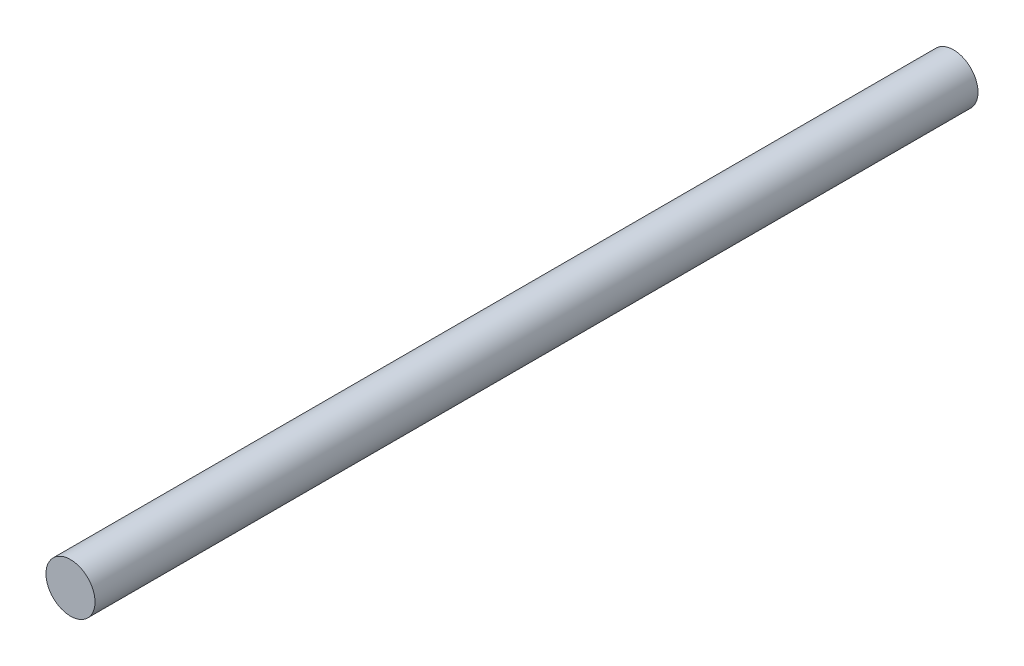
ISO-10303-21;
HEADER;
FILE_DESCRIPTION(('STEP AP214'),'2;1');
FILE_NAME('part.step','',(''),(''),'','','');
FILE_SCHEMA(('AUTOMOTIVE_DESIGN { 1 0 10303 214 1 1 1 1 }'));
ENDSEC;
DATA;
#1=APPLICATION_CONTEXT('core data for automotive mechanical design processes');
#2=APPLICATION_PROTOCOL_DEFINITION('international standard','automotive_design',2000,#1);
#3=PRODUCT_CONTEXT('',#1,'mechanical');
#4=PRODUCT('Part','Part','',(#3));
#5=PRODUCT_RELATED_PRODUCT_CATEGORY('part','',(#4));
#6=PRODUCT_DEFINITION_FORMATION('','',#4);
#7=PRODUCT_DEFINITION_CONTEXT('part definition',#1,'design');
#8=PRODUCT_DEFINITION('design','',#6,#7);
#9=PRODUCT_DEFINITION_SHAPE('','',#8);
#10=(LENGTH_UNIT() NAMED_UNIT(*) SI_UNIT(.MILLI.,.METRE.));
#11=(NAMED_UNIT(*) PLANE_ANGLE_UNIT() SI_UNIT($,.RADIAN.));
#12=(NAMED_UNIT(*) SI_UNIT($,.STERADIAN.) SOLID_ANGLE_UNIT());
#13=UNCERTAINTY_MEASURE_WITH_UNIT(LENGTH_MEASURE(1.E-05),#10,'distance_accuracy_value','');
#14=(GEOMETRIC_REPRESENTATION_CONTEXT(3) GLOBAL_UNCERTAINTY_ASSIGNED_CONTEXT((#13)) GLOBAL_UNIT_ASSIGNED_CONTEXT((#10,
#11,#12)) REPRESENTATION_CONTEXT('',''));
#15=CARTESIAN_POINT('',(0.,0.,0.));
#16=DIRECTION('',(0.,0.,1.));
#17=DIRECTION('',(1.,0.,0.));
#18=AXIS2_PLACEMENT_3D('',#15,#16,#17);
#19=CARTESIAN_POINT('',(0.,0.,228.6));
#20=DIRECTION('',(0.,0.,-1.));
#21=DIRECTION('',(-1.,0.,0.));
#22=AXIS2_PLACEMENT_3D('',#19,#20,#21);
#23=CYLINDRICAL_SURFACE('',#22,6.35);
#24=CARTESIAN_POINT('',(0.,0.,228.6));
#25=DIRECTION('',(0.,0.,1.));
#26=DIRECTION('',(1.,0.,0.));
#27=AXIS2_PLACEMENT_3D('',#24,#25,#26);
#28=CIRCLE('',#27,6.35);
#29=CARTESIAN_POINT('',(6.35,0.,228.6));
#30=VERTEX_POINT('',#29);
#31=EDGE_CURVE('E10',#30,#30,#28,.T.);
#32=ORIENTED_EDGE('',*,*,#31,.F.);
#33=EDGE_LOOP('',(#32));
#34=FACE_BOUND('',#33,.T.);
#35=CARTESIAN_POINT('',(0.,0.,0.));
#36=DIRECTION('',(0.,0.,1.));
#37=DIRECTION('',(1.,0.,0.));
#38=AXIS2_PLACEMENT_3D('',#35,#36,#37);
#39=CIRCLE('',#38,6.35);
#40=CARTESIAN_POINT('',(6.35,0.,0.));
#41=VERTEX_POINT('',#40);
#42=EDGE_CURVE('E37',#41,#41,#39,.T.);
#43=ORIENTED_EDGE('',*,*,#42,.T.);
#44=EDGE_LOOP('',(#43));
#45=FACE_BOUND('',#44,.T.);
#46=ADVANCED_FACE('F34',(#34,#45),#23,.T.);
#47=CARTESIAN_POINT('',(0.,0.,228.6));
#48=DIRECTION('',(0.,0.,1.));
#49=DIRECTION('',(1.,0.,0.));
#50=AXIS2_PLACEMENT_3D('',#47,#48,#49);
#51=PLANE('',#50);
#52=ORIENTED_EDGE('',*,*,#31,.T.);
#53=EDGE_LOOP('',(#52));
#54=FACE_BOUND('',#53,.T.);
#55=ADVANCED_FACE('F49',(#54),#51,.T.);
#56=CARTESIAN_POINT('',(0.,0.,0.));
#57=DIRECTION('',(0.,0.,1.));
#58=DIRECTION('',(1.,0.,0.));
#59=AXIS2_PLACEMENT_3D('',#56,#57,#58);
#60=PLANE('',#59);
#61=ORIENTED_EDGE('',*,*,#42,.F.);
#62=EDGE_LOOP('',(#61));
#63=FACE_BOUND('',#62,.T.);
#64=ADVANCED_FACE('F47',(#63),#60,.F.);
#65=CLOSED_SHELL('',(#46,#55,#64));
#66=MANIFOLD_SOLID_BREP('B2',#65);
#67=ADVANCED_BREP_SHAPE_REPRESENTATION('',(#18,#66),#14);
#68=SHAPE_DEFINITION_REPRESENTATION(#9,#67);
ENDSEC;
END-ISO-10303-21;
